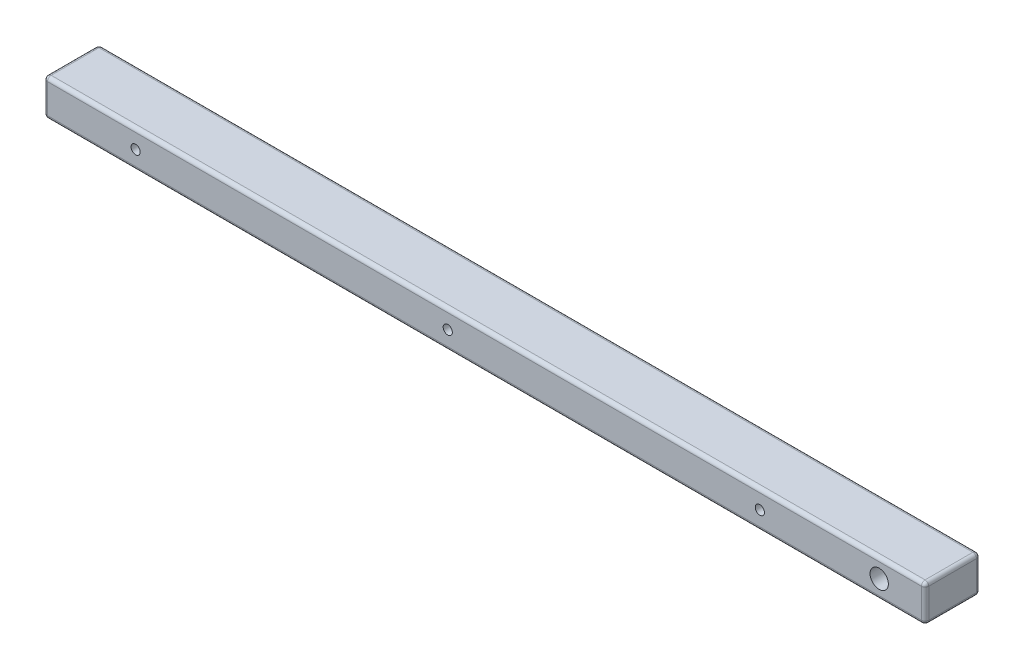
ISO-10303-21;
HEADER;
FILE_DESCRIPTION(('STEP AP214'),'2;1');
FILE_NAME('part.step','',(''),(''),'','','');
FILE_SCHEMA(('AUTOMOTIVE_DESIGN { 1 0 10303 214 1 1 1 1 }'));
ENDSEC;
DATA;
#1=APPLICATION_CONTEXT('core data for automotive mechanical design processes');
#2=APPLICATION_PROTOCOL_DEFINITION('international standard','automotive_design',2000,#1);
#3=PRODUCT_CONTEXT('',#1,'mechanical');
#4=PRODUCT('Part','Part','',(#3));
#5=PRODUCT_RELATED_PRODUCT_CATEGORY('part','',(#4));
#6=PRODUCT_DEFINITION_FORMATION('','',#4);
#7=PRODUCT_DEFINITION_CONTEXT('part definition',#1,'design');
#8=PRODUCT_DEFINITION('design','',#6,#7);
#9=PRODUCT_DEFINITION_SHAPE('','',#8);
#10=(LENGTH_UNIT() NAMED_UNIT(*) SI_UNIT(.MILLI.,.METRE.));
#11=(NAMED_UNIT(*) PLANE_ANGLE_UNIT() SI_UNIT($,.RADIAN.));
#12=(NAMED_UNIT(*) SI_UNIT($,.STERADIAN.) SOLID_ANGLE_UNIT());
#13=UNCERTAINTY_MEASURE_WITH_UNIT(LENGTH_MEASURE(1.E-05),#10,'distance_accuracy_value','');
#14=(GEOMETRIC_REPRESENTATION_CONTEXT(3) GLOBAL_UNCERTAINTY_ASSIGNED_CONTEXT((#13)) GLOBAL_UNIT_ASSIGNED_CONTEXT((#10,
#11,#12)) REPRESENTATION_CONTEXT('',''));
#15=CARTESIAN_POINT('',(0.,0.,0.));
#16=DIRECTION('',(0.,0.,1.));
#17=DIRECTION('',(1.,0.,0.));
#18=AXIS2_PLACEMENT_3D('',#15,#16,#17);
#19=CARTESIAN_POINT('',(-240.,20.,30.));
#20=DIRECTION('',(1.,0.,0.));
#21=DIRECTION('',(0.,0.,-1.));
#22=AXIS2_PLACEMENT_3D('',#19,#20,#21);
#23=PLANE('',#22);
#24=DIRECTION('',(0.,-1.,0.));
#25=VECTOR('',#24,1.);
#26=CARTESIAN_POINT('',(-240.,20.,2.));
#27=LINE('',#26,#25);
#28=CARTESIAN_POINT('',(-240.,18.,2.));
#29=VERTEX_POINT('',#28);
#30=CARTESIAN_POINT('',(-240.,2.,2.));
#31=VERTEX_POINT('',#30);
#32=EDGE_CURVE('E254',#29,#31,#27,.T.);
#33=ORIENTED_EDGE('',*,*,#32,.T.);
#34=DIRECTION('',(0.,0.,-1.));
#35=VECTOR('',#34,1.);
#36=CARTESIAN_POINT('',(-240.,2.,30.));
#37=LINE('',#36,#35);
#38=CARTESIAN_POINT('',(-240.,2.,28.));
#39=VERTEX_POINT('',#38);
#40=EDGE_CURVE('E261',#31,#39,#37,.F.);
#41=ORIENTED_EDGE('',*,*,#40,.T.);
#42=DIRECTION('',(0.,-1.,0.));
#43=VECTOR('',#42,1.);
#44=CARTESIAN_POINT('',(-240.,20.,28.));
#45=LINE('',#44,#43);
#46=CARTESIAN_POINT('',(-240.,18.,28.));
#47=VERTEX_POINT('',#46);
#48=EDGE_CURVE('E249',#39,#47,#45,.F.);
#49=ORIENTED_EDGE('',*,*,#48,.T.);
#50=DIRECTION('',(0.,0.,-1.));
#51=VECTOR('',#50,1.);
#52=CARTESIAN_POINT('',(-240.,18.,30.));
#53=LINE('',#52,#51);
#54=EDGE_CURVE('E244',#47,#29,#53,.T.);
#55=ORIENTED_EDGE('',*,*,#54,.T.);
#56=EDGE_LOOP('',(#33,#41,#49,#55));
#57=FACE_BOUND('',#56,.T.);
#58=ADVANCED_FACE('F42',(#57),#23,.F.);
#59=CARTESIAN_POINT('',(-240.,0.,30.));
#60=DIRECTION('',(0.,1.,0.));
#61=DIRECTION('',(0.,0.,1.));
#62=AXIS2_PLACEMENT_3D('',#59,#60,#61);
#63=PLANE('',#62);
#64=DIRECTION('',(0.,0.,-1.));
#65=VECTOR('',#64,1.);
#66=CARTESIAN_POINT('',(-238.,0.,30.));
#67=LINE('',#66,#65);
#68=CARTESIAN_POINT('',(-238.,0.,28.));
#69=VERTEX_POINT('',#68);
#70=CARTESIAN_POINT('',(-238.,0.,2.));
#71=VERTEX_POINT('',#70);
#72=EDGE_CURVE('E145',#69,#71,#67,.T.);
#73=ORIENTED_EDGE('',*,*,#72,.T.);
#74=DIRECTION('',(1.,0.,0.));
#75=VECTOR('',#74,1.);
#76=CARTESIAN_POINT('',(-240.,0.,2.));
#77=LINE('',#76,#75);
#78=CARTESIAN_POINT('',(238.,0.,2.));
#79=VERTEX_POINT('',#78);
#80=EDGE_CURVE('E140',#71,#79,#77,.T.);
#81=ORIENTED_EDGE('',*,*,#80,.T.);
#82=DIRECTION('',(0.,0.,-1.));
#83=VECTOR('',#82,1.);
#84=CARTESIAN_POINT('',(238.,0.,30.));
#85=LINE('',#84,#83);
#86=CARTESIAN_POINT('',(238.,0.,28.));
#87=VERTEX_POINT('',#86);
#88=EDGE_CURVE('E135',#79,#87,#85,.F.);
#89=ORIENTED_EDGE('',*,*,#88,.T.);
#90=DIRECTION('',(1.,0.,0.));
#91=VECTOR('',#90,1.);
#92=CARTESIAN_POINT('',(-240.,0.,28.));
#93=LINE('',#92,#91);
#94=EDGE_CURVE('E138',#87,#69,#93,.F.);
#95=ORIENTED_EDGE('',*,*,#94,.T.);
#96=EDGE_LOOP('',(#73,#81,#89,#95));
#97=FACE_BOUND('',#96,.T.);
#98=ADVANCED_FACE('F137',(#97),#63,.F.);
#99=CARTESIAN_POINT('',(240.,0.,30.));
#100=DIRECTION('',(-1.,0.,0.));
#101=DIRECTION('',(0.,0.,1.));
#102=AXIS2_PLACEMENT_3D('',#99,#100,#101);
#103=PLANE('',#102);
#104=DIRECTION('',(0.,1.,0.));
#105=VECTOR('',#104,1.);
#106=CARTESIAN_POINT('',(240.,0.,28.));
#107=LINE('',#106,#105);
#108=CARTESIAN_POINT('',(240.,18.,28.));
#109=VERTEX_POINT('',#108);
#110=CARTESIAN_POINT('',(240.,2.,28.));
#111=VERTEX_POINT('',#110);
#112=EDGE_CURVE('E321',#109,#111,#107,.F.);
#113=ORIENTED_EDGE('',*,*,#112,.T.);
#114=DIRECTION('',(0.,0.,-1.));
#115=VECTOR('',#114,1.);
#116=CARTESIAN_POINT('',(240.,2.,30.));
#117=LINE('',#116,#115);
#118=CARTESIAN_POINT('',(240.,2.,2.));
#119=VERTEX_POINT('',#118);
#120=EDGE_CURVE('E165',#111,#119,#117,.T.);
#121=ORIENTED_EDGE('',*,*,#120,.T.);
#122=DIRECTION('',(0.,1.,0.));
#123=VECTOR('',#122,1.);
#124=CARTESIAN_POINT('',(240.,0.,2.));
#125=LINE('',#124,#123);
#126=CARTESIAN_POINT('',(240.,18.,2.));
#127=VERTEX_POINT('',#126);
#128=EDGE_CURVE('E328',#119,#127,#125,.T.);
#129=ORIENTED_EDGE('',*,*,#128,.T.);
#130=DIRECTION('',(0.,0.,-1.));
#131=VECTOR('',#130,1.);
#132=CARTESIAN_POINT('',(240.,18.,30.));
#133=LINE('',#132,#131);
#134=EDGE_CURVE('E317',#127,#109,#133,.F.);
#135=ORIENTED_EDGE('',*,*,#134,.T.);
#136=EDGE_LOOP('',(#113,#121,#129,#135));
#137=FACE_BOUND('',#136,.T.);
#138=ADVANCED_FACE('F437',(#137),#103,.F.);
#139=CARTESIAN_POINT('',(240.,20.,30.));
#140=DIRECTION('',(0.,-1.,0.));
#141=DIRECTION('',(0.,0.,-1.));
#142=AXIS2_PLACEMENT_3D('',#139,#140,#141);
#143=PLANE('',#142);
#144=DIRECTION('',(0.,0.,-1.));
#145=VECTOR('',#144,1.);
#146=CARTESIAN_POINT('',(238.,20.,30.));
#147=LINE('',#146,#145);
#148=CARTESIAN_POINT('',(238.,20.,28.));
#149=VERTEX_POINT('',#148);
#150=CARTESIAN_POINT('',(238.,20.,2.));
#151=VERTEX_POINT('',#150);
#152=EDGE_CURVE('E337',#149,#151,#147,.T.);
#153=ORIENTED_EDGE('',*,*,#152,.T.);
#154=DIRECTION('',(-1.,0.,0.));
#155=VECTOR('',#154,1.);
#156=CARTESIAN_POINT('',(240.,20.,2.));
#157=LINE('',#156,#155);
#158=CARTESIAN_POINT('',(-238.,20.,2.));
#159=VERTEX_POINT('',#158);
#160=EDGE_CURVE('E250',#151,#159,#157,.T.);
#161=ORIENTED_EDGE('',*,*,#160,.T.);
#162=DIRECTION('',(0.,0.,-1.));
#163=VECTOR('',#162,1.);
#164=CARTESIAN_POINT('',(-238.,20.,30.));
#165=LINE('',#164,#163);
#166=CARTESIAN_POINT('',(-238.,20.,28.));
#167=VERTEX_POINT('',#166);
#168=EDGE_CURVE('E242',#159,#167,#165,.F.);
#169=ORIENTED_EDGE('',*,*,#168,.T.);
#170=DIRECTION('',(-1.,0.,0.));
#171=VECTOR('',#170,1.);
#172=CARTESIAN_POINT('',(240.,20.,28.));
#173=LINE('',#172,#171);
#174=EDGE_CURVE('E334',#167,#149,#173,.F.);
#175=ORIENTED_EDGE('',*,*,#174,.T.);
#176=EDGE_LOOP('',(#153,#161,#169,#175));
#177=FACE_BOUND('',#176,.T.);
#178=ADVANCED_FACE('F341',(#177),#143,.F.);
#179=CARTESIAN_POINT('',(0.,0.,30.));
#180=DIRECTION('',(0.,0.,1.));
#181=DIRECTION('',(1.,0.,0.));
#182=AXIS2_PLACEMENT_3D('',#179,#180,#181);
#183=PLANE('',#182);
#184=CARTESIAN_POINT('',(150.,10.,30.));
#185=DIRECTION('',(0.,0.,1.));
#186=DIRECTION('',(1.,0.,0.));
#187=AXIS2_PLACEMENT_3D('',#184,#185,#186);
#188=CIRCLE('',#187,2.5);
#189=CARTESIAN_POINT('',(152.5,10.,30.));
#190=VERTEX_POINT('',#189);
#191=EDGE_CURVE('E374',#190,#190,#188,.F.);
#192=ORIENTED_EDGE('',*,*,#191,.T.);
#193=EDGE_LOOP('',(#192));
#194=FACE_BOUND('',#193,.T.);
#195=CARTESIAN_POINT('',(-20.,10.,30.));
#196=DIRECTION('',(0.,0.,1.));
#197=DIRECTION('',(1.,0.,0.));
#198=AXIS2_PLACEMENT_3D('',#195,#196,#197);
#199=CIRCLE('',#198,2.49999999999999);
#200=CARTESIAN_POINT('',(-17.5,10.,30.));
#201=VERTEX_POINT('',#200);
#202=EDGE_CURVE('E382',#201,#201,#199,.F.);
#203=ORIENTED_EDGE('',*,*,#202,.T.);
#204=EDGE_LOOP('',(#203));
#205=FACE_BOUND('',#204,.T.);
#206=CARTESIAN_POINT('',(-190.,10.,30.));
#207=DIRECTION('',(0.,0.,1.));
#208=DIRECTION('',(1.,0.,0.));
#209=AXIS2_PLACEMENT_3D('',#206,#207,#208);
#210=CIRCLE('',#209,2.5);
#211=CARTESIAN_POINT('',(-187.5,10.,30.));
#212=VERTEX_POINT('',#211);
#213=EDGE_CURVE('E383',#212,#212,#210,.F.);
#214=ORIENTED_EDGE('',*,*,#213,.T.);
#215=EDGE_LOOP('',(#214));
#216=FACE_BOUND('',#215,.T.);
#217=CARTESIAN_POINT('',(215.,10.,30.));
#218=DIRECTION('',(0.,0.,-1.));
#219=DIRECTION('',(-1.,0.,0.));
#220=AXIS2_PLACEMENT_3D('',#217,#218,#219);
#221=CIRCLE('',#220,4.99999999999999);
#222=CARTESIAN_POINT('',(210.,10.,30.));
#223=VERTEX_POINT('',#222);
#224=EDGE_CURVE('E276',#223,#223,#221,.T.);
#225=ORIENTED_EDGE('',*,*,#224,.T.);
#226=EDGE_LOOP('',(#225));
#227=FACE_BOUND('',#226,.T.);
#228=DIRECTION('',(0.,-1.,0.));
#229=VECTOR('',#228,1.);
#230=CARTESIAN_POINT('',(-238.,0.,30.));
#231=LINE('',#230,#229);
#232=CARTESIAN_POINT('',(-238.,18.,30.));
#233=VERTEX_POINT('',#232);
#234=CARTESIAN_POINT('',(-238.,2.,30.));
#235=VERTEX_POINT('',#234);
#236=EDGE_CURVE('E52',#233,#235,#231,.T.);
#237=ORIENTED_EDGE('',*,*,#236,.T.);
#238=DIRECTION('',(1.,0.,0.));
#239=VECTOR('',#238,1.);
#240=CARTESIAN_POINT('',(240.,2.,30.));
#241=LINE('',#240,#239);
#242=CARTESIAN_POINT('',(238.,2.,30.));
#243=VERTEX_POINT('',#242);
#244=EDGE_CURVE('E11',#235,#243,#241,.T.);
#245=ORIENTED_EDGE('',*,*,#244,.T.);
#246=DIRECTION('',(0.,1.,0.));
#247=VECTOR('',#246,1.);
#248=CARTESIAN_POINT('',(238.,20.,30.));
#249=LINE('',#248,#247);
#250=CARTESIAN_POINT('',(238.,18.,30.));
#251=VERTEX_POINT('',#250);
#252=EDGE_CURVE('E267',#243,#251,#249,.T.);
#253=ORIENTED_EDGE('',*,*,#252,.T.);
#254=DIRECTION('',(-1.,0.,0.));
#255=VECTOR('',#254,1.);
#256=CARTESIAN_POINT('',(-240.,18.,30.));
#257=LINE('',#256,#255);
#258=EDGE_CURVE('E264',#251,#233,#257,.T.);
#259=ORIENTED_EDGE('',*,*,#258,.T.);
#260=EDGE_LOOP('',(#237,#245,#253,#259));
#261=FACE_BOUND('',#260,.T.);
#262=ADVANCED_FACE('F407',(#194,#205,#216,#227,#261),#183,.T.);
#263=CARTESIAN_POINT('',(0.,0.,0.));
#264=DIRECTION('',(0.,0.,1.));
#265=DIRECTION('',(1.,0.,0.));
#266=AXIS2_PLACEMENT_3D('',#263,#264,#265);
#267=PLANE('',#266);
#268=CARTESIAN_POINT('',(150.,10.,0.));
#269=DIRECTION('',(0.,0.,-1.));
#270=DIRECTION('',(-1.,0.,0.));
#271=AXIS2_PLACEMENT_3D('',#268,#269,#270);
#272=CIRCLE('',#271,2.5);
#273=CARTESIAN_POINT('',(147.5,10.,0.));
#274=VERTEX_POINT('',#273);
#275=EDGE_CURVE('E391',#274,#274,#272,.T.);
#276=ORIENTED_EDGE('',*,*,#275,.F.);
#277=EDGE_LOOP('',(#276));
#278=FACE_BOUND('',#277,.T.);
#279=CARTESIAN_POINT('',(-20.,10.,0.));
#280=DIRECTION('',(0.,0.,-1.));
#281=DIRECTION('',(-1.,0.,0.));
#282=AXIS2_PLACEMENT_3D('',#279,#280,#281);
#283=CIRCLE('',#282,2.49999999999999);
#284=CARTESIAN_POINT('',(-22.5,10.,0.));
#285=VERTEX_POINT('',#284);
#286=EDGE_CURVE('E387',#285,#285,#283,.T.);
#287=ORIENTED_EDGE('',*,*,#286,.F.);
#288=EDGE_LOOP('',(#287));
#289=FACE_BOUND('',#288,.T.);
#290=CARTESIAN_POINT('',(-190.,10.,0.));
#291=DIRECTION('',(0.,0.,-1.));
#292=DIRECTION('',(-1.,0.,0.));
#293=AXIS2_PLACEMENT_3D('',#290,#291,#292);
#294=CIRCLE('',#293,2.5);
#295=CARTESIAN_POINT('',(-192.5,10.,0.));
#296=VERTEX_POINT('',#295);
#297=EDGE_CURVE('E378',#296,#296,#294,.T.);
#298=ORIENTED_EDGE('',*,*,#297,.F.);
#299=EDGE_LOOP('',(#298));
#300=FACE_BOUND('',#299,.T.);
#301=CARTESIAN_POINT('',(215.,10.,0.));
#302=DIRECTION('',(0.,0.,-1.));
#303=DIRECTION('',(-1.,0.,0.));
#304=AXIS2_PLACEMENT_3D('',#301,#302,#303);
#305=CIRCLE('',#304,4.99999999999999);
#306=CARTESIAN_POINT('',(210.,10.,0.));
#307=VERTEX_POINT('',#306);
#308=EDGE_CURVE('E370',#307,#307,#305,.T.);
#309=ORIENTED_EDGE('',*,*,#308,.F.);
#310=EDGE_LOOP('',(#309));
#311=FACE_BOUND('',#310,.T.);
#312=DIRECTION('',(0.,1.,0.));
#313=VECTOR('',#312,1.);
#314=CARTESIAN_POINT('',(238.,0.,0.));
#315=LINE('',#314,#313);
#316=CARTESIAN_POINT('',(238.,18.,0.));
#317=VERTEX_POINT('',#316);
#318=CARTESIAN_POINT('',(238.,2.,0.));
#319=VERTEX_POINT('',#318);
#320=EDGE_CURVE('E312',#317,#319,#315,.F.);
#321=ORIENTED_EDGE('',*,*,#320,.T.);
#322=DIRECTION('',(1.,0.,0.));
#323=VECTOR('',#322,1.);
#324=CARTESIAN_POINT('',(0.,2.,0.));
#325=LINE('',#324,#323);
#326=CARTESIAN_POINT('',(-238.,2.,0.));
#327=VERTEX_POINT('',#326);
#328=EDGE_CURVE('E309',#319,#327,#325,.F.);
#329=ORIENTED_EDGE('',*,*,#328,.T.);
#330=DIRECTION('',(0.,-1.,0.));
#331=VECTOR('',#330,1.);
#332=CARTESIAN_POINT('',(-238.,0.,0.));
#333=LINE('',#332,#331);
#334=CARTESIAN_POINT('',(-238.,18.,0.));
#335=VERTEX_POINT('',#334);
#336=EDGE_CURVE('E300',#327,#335,#333,.F.);
#337=ORIENTED_EDGE('',*,*,#336,.T.);
#338=DIRECTION('',(-1.,0.,0.));
#339=VECTOR('',#338,1.);
#340=CARTESIAN_POINT('',(0.,18.,0.));
#341=LINE('',#340,#339);
#342=EDGE_CURVE('E306',#335,#317,#341,.F.);
#343=ORIENTED_EDGE('',*,*,#342,.T.);
#344=EDGE_LOOP('',(#321,#329,#337,#343));
#345=FACE_BOUND('',#344,.T.);
#346=ADVANCED_FACE('F310',(#278,#289,#300,#311,#345),#267,.F.);
#347=CARTESIAN_POINT('',(0.,18.,28.));
#348=DIRECTION('',(1.,0.,0.));
#349=DIRECTION('',(0.,0.,-1.));
#350=AXIS2_PLACEMENT_3D('',#347,#348,#349);
#351=CYLINDRICAL_SURFACE('',#350,2.);
#352=CARTESIAN_POINT('',(-238.,18.,28.));
#353=DIRECTION('',(-1.,0.,0.));
#354=DIRECTION('',(0.,0.,1.));
#355=AXIS2_PLACEMENT_3D('',#352,#353,#354);
#356=CIRCLE('',#355,2.);
#357=EDGE_CURVE('E46',#233,#167,#356,.T.);
#358=ORIENTED_EDGE('',*,*,#357,.F.);
#359=ORIENTED_EDGE('',*,*,#258,.F.);
#360=CARTESIAN_POINT('',(238.,18.,28.));
#361=DIRECTION('',(1.,0.,0.));
#362=DIRECTION('',(0.,0.,-1.));
#363=AXIS2_PLACEMENT_3D('',#360,#361,#362);
#364=CIRCLE('',#363,2.);
#365=EDGE_CURVE('E219',#149,#251,#364,.T.);
#366=ORIENTED_EDGE('',*,*,#365,.F.);
#367=ORIENTED_EDGE('',*,*,#174,.F.);
#368=EDGE_LOOP('',(#358,#359,#366,#367));
#369=FACE_BOUND('',#368,.T.);
#370=ADVANCED_FACE('F44',(#369),#351,.T.);
#371=CARTESIAN_POINT('',(-238.,18.,28.));
#372=DIRECTION('',(0.,1.,0.));
#373=DIRECTION('',(0.,0.,1.));
#374=AXIS2_PLACEMENT_3D('',#371,#372,#373);
#375=SPHERICAL_SURFACE('',#374,2.);
#376=CARTESIAN_POINT('',(-238.,18.,28.));
#377=DIRECTION('',(0.,1.,0.));
#378=DIRECTION('',(0.,0.,1.));
#379=AXIS2_PLACEMENT_3D('',#376,#377,#378);
#380=CIRCLE('',#379,2.);
#381=EDGE_CURVE('E212',#233,#47,#380,.F.);
#382=ORIENTED_EDGE('',*,*,#381,.F.);
#383=ORIENTED_EDGE('',*,*,#357,.T.);
#384=CARTESIAN_POINT('',(-238.,18.,28.));
#385=DIRECTION('',(0.,0.,1.));
#386=DIRECTION('',(1.,0.,0.));
#387=AXIS2_PLACEMENT_3D('',#384,#385,#386);
#388=CIRCLE('',#387,2.);
#389=EDGE_CURVE('E216',#47,#167,#388,.F.);
#390=ORIENTED_EDGE('',*,*,#389,.F.);
#391=EDGE_LOOP('',(#382,#383,#390));
#392=FACE_BOUND('',#391,.T.);
#393=ADVANCED_FACE('F232',(#392),#375,.T.);
#394=CARTESIAN_POINT('',(238.,18.,28.));
#395=DIRECTION('',(0.,0.,1.));
#396=DIRECTION('',(1.,0.,0.));
#397=AXIS2_PLACEMENT_3D('',#394,#395,#396);
#398=SPHERICAL_SURFACE('',#397,2.);
#399=CARTESIAN_POINT('',(238.,18.,28.));
#400=DIRECTION('',(0.,0.,1.));
#401=DIRECTION('',(1.,0.,0.));
#402=AXIS2_PLACEMENT_3D('',#399,#400,#401);
#403=CIRCLE('',#402,2.);
#404=EDGE_CURVE('E204',#149,#109,#403,.F.);
#405=ORIENTED_EDGE('',*,*,#404,.F.);
#406=ORIENTED_EDGE('',*,*,#365,.T.);
#407=CARTESIAN_POINT('',(238.,18.,28.));
#408=DIRECTION('',(0.,1.,0.));
#409=DIRECTION('',(0.,0.,1.));
#410=AXIS2_PLACEMENT_3D('',#407,#408,#409);
#411=CIRCLE('',#410,2.);
#412=EDGE_CURVE('E208',#109,#251,#411,.F.);
#413=ORIENTED_EDGE('',*,*,#412,.F.);
#414=EDGE_LOOP('',(#405,#406,#413));
#415=FACE_BOUND('',#414,.T.);
#416=ADVANCED_FACE('F344',(#415),#398,.T.);
#417=CARTESIAN_POINT('',(-238.,18.,30.));
#418=DIRECTION('',(0.,0.,-1.));
#419=DIRECTION('',(-1.,0.,0.));
#420=AXIS2_PLACEMENT_3D('',#417,#418,#419);
#421=CYLINDRICAL_SURFACE('',#420,2.);
#422=ORIENTED_EDGE('',*,*,#389,.T.);
#423=ORIENTED_EDGE('',*,*,#168,.F.);
#424=CARTESIAN_POINT('',(-238.,18.,2.));
#425=DIRECTION('',(0.,0.,-1.));
#426=DIRECTION('',(-1.,0.,0.));
#427=AXIS2_PLACEMENT_3D('',#424,#425,#426);
#428=CIRCLE('',#427,2.);
#429=EDGE_CURVE('E197',#29,#159,#428,.T.);
#430=ORIENTED_EDGE('',*,*,#429,.F.);
#431=ORIENTED_EDGE('',*,*,#54,.F.);
#432=EDGE_LOOP('',(#422,#423,#430,#431));
#433=FACE_BOUND('',#432,.T.);
#434=ADVANCED_FACE('F240',(#433),#421,.T.);
#435=CARTESIAN_POINT('',(-238.,0.,28.));
#436=DIRECTION('',(0.,1.,0.));
#437=DIRECTION('',(0.,0.,1.));
#438=AXIS2_PLACEMENT_3D('',#435,#436,#437);
#439=CYLINDRICAL_SURFACE('',#438,2.);
#440=ORIENTED_EDGE('',*,*,#381,.T.);
#441=ORIENTED_EDGE('',*,*,#48,.F.);
#442=CARTESIAN_POINT('',(-238.,2.,28.));
#443=DIRECTION('',(0.,-1.,0.));
#444=DIRECTION('',(0.,0.,-1.));
#445=AXIS2_PLACEMENT_3D('',#442,#443,#444);
#446=CIRCLE('',#445,2.);
#447=EDGE_CURVE('E194',#235,#39,#446,.T.);
#448=ORIENTED_EDGE('',*,*,#447,.F.);
#449=ORIENTED_EDGE('',*,*,#236,.F.);
#450=EDGE_LOOP('',(#440,#441,#448,#449));
#451=FACE_BOUND('',#450,.T.);
#452=ADVANCED_FACE('F360',(#451),#439,.T.);
#453=CARTESIAN_POINT('',(0.,2.,28.));
#454=DIRECTION('',(-1.,0.,0.));
#455=DIRECTION('',(0.,0.,1.));
#456=AXIS2_PLACEMENT_3D('',#453,#454,#455);
#457=CYLINDRICAL_SURFACE('',#456,2.);
#458=CARTESIAN_POINT('',(238.,2.,28.));
#459=DIRECTION('',(1.,0.,0.));
#460=DIRECTION('',(0.,0.,-1.));
#461=AXIS2_PLACEMENT_3D('',#458,#459,#460);
#462=CIRCLE('',#461,2.);
#463=EDGE_CURVE('E151',#243,#87,#462,.T.);
#464=ORIENTED_EDGE('',*,*,#463,.F.);
#465=ORIENTED_EDGE('',*,*,#244,.F.);
#466=CARTESIAN_POINT('',(-238.,2.,28.));
#467=DIRECTION('',(-1.,0.,0.));
#468=DIRECTION('',(0.,0.,1.));
#469=AXIS2_PLACEMENT_3D('',#466,#467,#468);
#470=CIRCLE('',#469,2.);
#471=EDGE_CURVE('E60',#69,#235,#470,.T.);
#472=ORIENTED_EDGE('',*,*,#471,.F.);
#473=ORIENTED_EDGE('',*,*,#94,.F.);
#474=EDGE_LOOP('',(#464,#465,#472,#473));
#475=FACE_BOUND('',#474,.T.);
#476=ADVANCED_FACE('F150',(#475),#457,.T.);
#477=CARTESIAN_POINT('',(238.,0.,28.));
#478=DIRECTION('',(0.,-1.,0.));
#479=DIRECTION('',(0.,0.,-1.));
#480=AXIS2_PLACEMENT_3D('',#477,#478,#479);
#481=CYLINDRICAL_SURFACE('',#480,2.);
#482=ORIENTED_EDGE('',*,*,#412,.T.);
#483=ORIENTED_EDGE('',*,*,#252,.F.);
#484=CARTESIAN_POINT('',(238.,2.,28.));
#485=DIRECTION('',(0.,-1.,0.));
#486=DIRECTION('',(0.,0.,-1.));
#487=AXIS2_PLACEMENT_3D('',#484,#485,#486);
#488=CIRCLE('',#487,2.);
#489=EDGE_CURVE('E161',#111,#243,#488,.T.);
#490=ORIENTED_EDGE('',*,*,#489,.F.);
#491=ORIENTED_EDGE('',*,*,#112,.F.);
#492=EDGE_LOOP('',(#482,#483,#490,#491));
#493=FACE_BOUND('',#492,.T.);
#494=ADVANCED_FACE('F470',(#493),#481,.T.);
#495=CARTESIAN_POINT('',(238.,18.,30.));
#496=DIRECTION('',(0.,0.,-1.));
#497=DIRECTION('',(-1.,0.,0.));
#498=AXIS2_PLACEMENT_3D('',#495,#496,#497);
#499=CYLINDRICAL_SURFACE('',#498,2.);
#500=ORIENTED_EDGE('',*,*,#404,.T.);
#501=ORIENTED_EDGE('',*,*,#134,.F.);
#502=CARTESIAN_POINT('',(238.,18.,2.));
#503=DIRECTION('',(0.,0.,-1.));
#504=DIRECTION('',(-1.,0.,0.));
#505=AXIS2_PLACEMENT_3D('',#502,#503,#504);
#506=CIRCLE('',#505,2.);
#507=EDGE_CURVE('E186',#151,#127,#506,.T.);
#508=ORIENTED_EDGE('',*,*,#507,.F.);
#509=ORIENTED_EDGE('',*,*,#152,.F.);
#510=EDGE_LOOP('',(#500,#501,#508,#509));
#511=FACE_BOUND('',#510,.T.);
#512=ADVANCED_FACE('F349',(#511),#499,.T.);
#513=CARTESIAN_POINT('',(240.,18.,2.));
#514=DIRECTION('',(-1.,0.,0.));
#515=DIRECTION('',(0.,0.,1.));
#516=AXIS2_PLACEMENT_3D('',#513,#514,#515);
#517=CYLINDRICAL_SURFACE('',#516,2.);
#518=CARTESIAN_POINT('',(-238.,18.,2.));
#519=DIRECTION('',(-1.,0.,0.));
#520=DIRECTION('',(0.,0.,1.));
#521=AXIS2_PLACEMENT_3D('',#518,#519,#520);
#522=CIRCLE('',#521,2.);
#523=EDGE_CURVE('E200',#159,#335,#522,.T.);
#524=ORIENTED_EDGE('',*,*,#523,.F.);
#525=ORIENTED_EDGE('',*,*,#160,.F.);
#526=CARTESIAN_POINT('',(238.,18.,2.));
#527=DIRECTION('',(1.,0.,0.));
#528=DIRECTION('',(0.,0.,-1.));
#529=AXIS2_PLACEMENT_3D('',#526,#527,#528);
#530=CIRCLE('',#529,2.);
#531=EDGE_CURVE('E182',#317,#151,#530,.T.);
#532=ORIENTED_EDGE('',*,*,#531,.F.);
#533=ORIENTED_EDGE('',*,*,#342,.F.);
#534=EDGE_LOOP('',(#524,#525,#532,#533));
#535=FACE_BOUND('',#534,.T.);
#536=ADVANCED_FACE('F353',(#535),#517,.T.);
#537=CARTESIAN_POINT('',(-238.,18.,2.));
#538=DIRECTION('',(0.,1.,0.));
#539=DIRECTION('',(0.,0.,1.));
#540=AXIS2_PLACEMENT_3D('',#537,#538,#539);
#541=SPHERICAL_SURFACE('',#540,2.);
#542=ORIENTED_EDGE('',*,*,#429,.T.);
#543=ORIENTED_EDGE('',*,*,#523,.T.);
#544=CARTESIAN_POINT('',(-238.,18.,2.));
#545=DIRECTION('',(0.,1.,0.));
#546=DIRECTION('',(0.,0.,1.));
#547=AXIS2_PLACEMENT_3D('',#544,#545,#546);
#548=CIRCLE('',#547,2.);
#549=EDGE_CURVE('E173',#29,#335,#548,.F.);
#550=ORIENTED_EDGE('',*,*,#549,.F.);
#551=EDGE_LOOP('',(#542,#543,#550));
#552=FACE_BOUND('',#551,.T.);
#553=ADVANCED_FACE('F356',(#552),#541,.T.);
#554=CARTESIAN_POINT('',(-238.,2.,28.));
#555=DIRECTION('',(0.,0.,1.));
#556=DIRECTION('',(1.,0.,0.));
#557=AXIS2_PLACEMENT_3D('',#554,#555,#556);
#558=SPHERICAL_SURFACE('',#557,2.);
#559=ORIENTED_EDGE('',*,*,#471,.T.);
#560=ORIENTED_EDGE('',*,*,#447,.T.);
#561=CARTESIAN_POINT('',(-238.,2.,28.));
#562=DIRECTION('',(0.,0.,1.));
#563=DIRECTION('',(1.,0.,0.));
#564=AXIS2_PLACEMENT_3D('',#561,#562,#563);
#565=CIRCLE('',#564,2.);
#566=EDGE_CURVE('E167',#69,#39,#565,.F.);
#567=ORIENTED_EDGE('',*,*,#566,.F.);
#568=EDGE_LOOP('',(#559,#560,#567));
#569=FACE_BOUND('',#568,.T.);
#570=ADVANCED_FACE('F361',(#569),#558,.T.);
#571=CARTESIAN_POINT('',(238.,2.,28.));
#572=DIRECTION('',(0.,0.,1.));
#573=DIRECTION('',(1.,0.,0.));
#574=AXIS2_PLACEMENT_3D('',#571,#572,#573);
#575=SPHERICAL_SURFACE('',#574,2.);
#576=ORIENTED_EDGE('',*,*,#489,.T.);
#577=ORIENTED_EDGE('',*,*,#463,.T.);
#578=CARTESIAN_POINT('',(238.,2.,28.));
#579=DIRECTION('',(0.,0.,1.));
#580=DIRECTION('',(1.,0.,0.));
#581=AXIS2_PLACEMENT_3D('',#578,#579,#580);
#582=CIRCLE('',#581,2.);
#583=EDGE_CURVE('E158',#111,#87,#582,.F.);
#584=ORIENTED_EDGE('',*,*,#583,.F.);
#585=EDGE_LOOP('',(#576,#577,#584));
#586=FACE_BOUND('',#585,.T.);
#587=ADVANCED_FACE('F157',(#586),#575,.T.);
#588=CARTESIAN_POINT('',(238.,18.,2.));
#589=DIRECTION('',(0.,1.,0.));
#590=DIRECTION('',(0.,0.,1.));
#591=AXIS2_PLACEMENT_3D('',#588,#589,#590);
#592=SPHERICAL_SURFACE('',#591,2.);
#593=ORIENTED_EDGE('',*,*,#531,.T.);
#594=ORIENTED_EDGE('',*,*,#507,.T.);
#595=CARTESIAN_POINT('',(238.,18.,2.));
#596=DIRECTION('',(0.,1.,0.));
#597=DIRECTION('',(0.,0.,1.));
#598=AXIS2_PLACEMENT_3D('',#595,#596,#597);
#599=CIRCLE('',#598,2.);
#600=EDGE_CURVE('E168',#317,#127,#599,.F.);
#601=ORIENTED_EDGE('',*,*,#600,.F.);
#602=EDGE_LOOP('',(#593,#594,#601));
#603=FACE_BOUND('',#602,.T.);
#604=ADVANCED_FACE('F456',(#603),#592,.T.);
#605=CARTESIAN_POINT('',(-238.,20.,2.));
#606=DIRECTION('',(0.,-1.,0.));
#607=DIRECTION('',(0.,0.,-1.));
#608=AXIS2_PLACEMENT_3D('',#605,#606,#607);
#609=CYLINDRICAL_SURFACE('',#608,2.);
#610=ORIENTED_EDGE('',*,*,#549,.T.);
#611=ORIENTED_EDGE('',*,*,#336,.F.);
#612=CARTESIAN_POINT('',(-238.,2.,2.));
#613=DIRECTION('',(0.,-1.,0.));
#614=DIRECTION('',(0.,0.,-1.));
#615=AXIS2_PLACEMENT_3D('',#612,#613,#614);
#616=CIRCLE('',#615,2.);
#617=EDGE_CURVE('E175',#31,#327,#616,.T.);
#618=ORIENTED_EDGE('',*,*,#617,.F.);
#619=ORIENTED_EDGE('',*,*,#32,.F.);
#620=EDGE_LOOP('',(#610,#611,#618,#619));
#621=FACE_BOUND('',#620,.T.);
#622=ADVANCED_FACE('F302',(#621),#609,.T.);
#623=CARTESIAN_POINT('',(-238.,2.,30.));
#624=DIRECTION('',(0.,0.,-1.));
#625=DIRECTION('',(-1.,0.,0.));
#626=AXIS2_PLACEMENT_3D('',#623,#624,#625);
#627=CYLINDRICAL_SURFACE('',#626,2.);
#628=ORIENTED_EDGE('',*,*,#566,.T.);
#629=ORIENTED_EDGE('',*,*,#40,.F.);
#630=CARTESIAN_POINT('',(-238.,2.,2.));
#631=DIRECTION('',(0.,0.,-1.));
#632=DIRECTION('',(-1.,0.,0.));
#633=AXIS2_PLACEMENT_3D('',#630,#631,#632);
#634=CIRCLE('',#633,2.);
#635=EDGE_CURVE('E287',#71,#31,#634,.T.);
#636=ORIENTED_EDGE('',*,*,#635,.F.);
#637=ORIENTED_EDGE('',*,*,#72,.F.);
#638=EDGE_LOOP('',(#628,#629,#636,#637));
#639=FACE_BOUND('',#638,.T.);
#640=ADVANCED_FACE('F363',(#639),#627,.T.);
#641=CARTESIAN_POINT('',(238.,2.,30.));
#642=DIRECTION('',(0.,0.,-1.));
#643=DIRECTION('',(-1.,0.,0.));
#644=AXIS2_PLACEMENT_3D('',#641,#642,#643);
#645=CYLINDRICAL_SURFACE('',#644,2.);
#646=ORIENTED_EDGE('',*,*,#583,.T.);
#647=ORIENTED_EDGE('',*,*,#88,.F.);
#648=CARTESIAN_POINT('',(238.,2.,2.));
#649=DIRECTION('',(0.,0.,-1.));
#650=DIRECTION('',(-1.,0.,0.));
#651=AXIS2_PLACEMENT_3D('',#648,#649,#650);
#652=CIRCLE('',#651,2.);
#653=EDGE_CURVE('E283',#119,#79,#652,.T.);
#654=ORIENTED_EDGE('',*,*,#653,.F.);
#655=ORIENTED_EDGE('',*,*,#120,.F.);
#656=EDGE_LOOP('',(#646,#647,#654,#655));
#657=FACE_BOUND('',#656,.T.);
#658=ADVANCED_FACE('F164',(#657),#645,.T.);
#659=CARTESIAN_POINT('',(238.,0.,2.));
#660=DIRECTION('',(0.,1.,0.));
#661=DIRECTION('',(0.,0.,1.));
#662=AXIS2_PLACEMENT_3D('',#659,#660,#661);
#663=CYLINDRICAL_SURFACE('',#662,2.);
#664=ORIENTED_EDGE('',*,*,#600,.T.);
#665=ORIENTED_EDGE('',*,*,#128,.F.);
#666=CARTESIAN_POINT('',(238.,2.,2.));
#667=DIRECTION('',(0.,-1.,0.));
#668=DIRECTION('',(0.,0.,-1.));
#669=AXIS2_PLACEMENT_3D('',#666,#667,#668);
#670=CIRCLE('',#669,2.);
#671=EDGE_CURVE('E279',#319,#119,#670,.T.);
#672=ORIENTED_EDGE('',*,*,#671,.F.);
#673=ORIENTED_EDGE('',*,*,#320,.F.);
#674=EDGE_LOOP('',(#664,#665,#672,#673));
#675=FACE_BOUND('',#674,.T.);
#676=ADVANCED_FACE('F446',(#675),#663,.T.);
#677=CARTESIAN_POINT('',(-238.,2.,2.));
#678=DIRECTION('',(-1.,0.,0.));
#679=DIRECTION('',(0.,0.,1.));
#680=AXIS2_PLACEMENT_3D('',#677,#678,#679);
#681=SPHERICAL_SURFACE('',#680,2.);
#682=ORIENTED_EDGE('',*,*,#635,.T.);
#683=ORIENTED_EDGE('',*,*,#617,.T.);
#684=CARTESIAN_POINT('',(-238.,2.,2.));
#685=DIRECTION('',(-1.,0.,0.));
#686=DIRECTION('',(0.,0.,1.));
#687=AXIS2_PLACEMENT_3D('',#684,#685,#686);
#688=CIRCLE('',#687,2.);
#689=EDGE_CURVE('E275',#71,#327,#688,.F.);
#690=ORIENTED_EDGE('',*,*,#689,.F.);
#691=EDGE_LOOP('',(#682,#683,#690));
#692=FACE_BOUND('',#691,.T.);
#693=ADVANCED_FACE('F295',(#692),#681,.T.);
#694=CARTESIAN_POINT('',(238.,2.,2.));
#695=DIRECTION('',(1.,0.,0.));
#696=DIRECTION('',(0.,0.,-1.));
#697=AXIS2_PLACEMENT_3D('',#694,#695,#696);
#698=SPHERICAL_SURFACE('',#697,2.);
#699=ORIENTED_EDGE('',*,*,#671,.T.);
#700=ORIENTED_EDGE('',*,*,#653,.T.);
#701=CARTESIAN_POINT('',(238.,2.,2.));
#702=DIRECTION('',(1.,0.,0.));
#703=DIRECTION('',(0.,0.,-1.));
#704=AXIS2_PLACEMENT_3D('',#701,#702,#703);
#705=CIRCLE('',#704,2.);
#706=EDGE_CURVE('E272',#319,#79,#705,.F.);
#707=ORIENTED_EDGE('',*,*,#706,.F.);
#708=EDGE_LOOP('',(#699,#700,#707));
#709=FACE_BOUND('',#708,.T.);
#710=ADVANCED_FACE('F428',(#709),#698,.T.);
#711=CARTESIAN_POINT('',(-240.,2.,2.));
#712=DIRECTION('',(1.,0.,0.));
#713=DIRECTION('',(0.,0.,-1.));
#714=AXIS2_PLACEMENT_3D('',#711,#712,#713);
#715=CYLINDRICAL_SURFACE('',#714,2.);
#716=ORIENTED_EDGE('',*,*,#689,.T.);
#717=ORIENTED_EDGE('',*,*,#328,.F.);
#718=ORIENTED_EDGE('',*,*,#706,.T.);
#719=ORIENTED_EDGE('',*,*,#80,.F.);
#720=EDGE_LOOP('',(#716,#717,#718,#719));
#721=FACE_BOUND('',#720,.T.);
#722=ADVANCED_FACE('F418',(#721),#715,.T.);
#723=CARTESIAN_POINT('',(215.,10.,30.));
#724=DIRECTION('',(0.,0.,-1.));
#725=DIRECTION('',(-1.,0.,0.));
#726=AXIS2_PLACEMENT_3D('',#723,#724,#725);
#727=CYLINDRICAL_SURFACE('',#726,4.99999999999999);
#728=ORIENTED_EDGE('',*,*,#224,.F.);
#729=EDGE_LOOP('',(#728));
#730=FACE_BOUND('',#729,.T.);
#731=ORIENTED_EDGE('',*,*,#308,.T.);
#732=EDGE_LOOP('',(#731));
#733=FACE_BOUND('',#732,.T.);
#734=ADVANCED_FACE('F415',(#730,#733),#727,.F.);
#735=CARTESIAN_POINT('',(-190.,10.,37.0710678118655));
#736=DIRECTION('',(0.,0.,-1.));
#737=DIRECTION('',(-1.,0.,0.));
#738=AXIS2_PLACEMENT_3D('',#735,#736,#737);
#739=CYLINDRICAL_SURFACE('',#738,2.5);
#740=ORIENTED_EDGE('',*,*,#297,.T.);
#741=EDGE_LOOP('',(#740));
#742=FACE_BOUND('',#741,.T.);
#743=ORIENTED_EDGE('',*,*,#213,.F.);
#744=EDGE_LOOP('',(#743));
#745=FACE_BOUND('',#744,.T.);
#746=ADVANCED_FACE('F417',(#742,#745),#739,.F.);
#747=CARTESIAN_POINT('',(-20.,10.,37.0710678118655));
#748=DIRECTION('',(0.,0.,-1.));
#749=DIRECTION('',(-1.,0.,0.));
#750=AXIS2_PLACEMENT_3D('',#747,#748,#749);
#751=CYLINDRICAL_SURFACE('',#750,2.49999999999999);
#752=ORIENTED_EDGE('',*,*,#286,.T.);
#753=EDGE_LOOP('',(#752));
#754=FACE_BOUND('',#753,.T.);
#755=ORIENTED_EDGE('',*,*,#202,.F.);
#756=EDGE_LOOP('',(#755));
#757=FACE_BOUND('',#756,.T.);
#758=ADVANCED_FACE('F425',(#754,#757),#751,.F.);
#759=CARTESIAN_POINT('',(150.,10.,37.0710678118655));
#760=DIRECTION('',(0.,0.,-1.));
#761=DIRECTION('',(-1.,0.,0.));
#762=AXIS2_PLACEMENT_3D('',#759,#760,#761);
#763=CYLINDRICAL_SURFACE('',#762,2.5);
#764=ORIENTED_EDGE('',*,*,#275,.T.);
#765=EDGE_LOOP('',(#764));
#766=FACE_BOUND('',#765,.T.);
#767=ORIENTED_EDGE('',*,*,#191,.F.);
#768=EDGE_LOOP('',(#767));
#769=FACE_BOUND('',#768,.T.);
#770=ADVANCED_FACE('F402',(#766,#769),#763,.F.);
#771=CLOSED_SHELL('',(#58,#98,#138,#178,#262,#346,#370,#393,#416,#434,#452,#476,#494,#512,#536,
#553,#570,#587,#604,#622,#640,#658,#676,#693,#710,#722,#734,#746,#758,#770));
#772=MANIFOLD_SOLID_BREP('B2',#771);
#773=ADVANCED_BREP_SHAPE_REPRESENTATION('',(#18,#772),#14);
#774=SHAPE_DEFINITION_REPRESENTATION(#9,#773);
ENDSEC;
END-ISO-10303-21;
